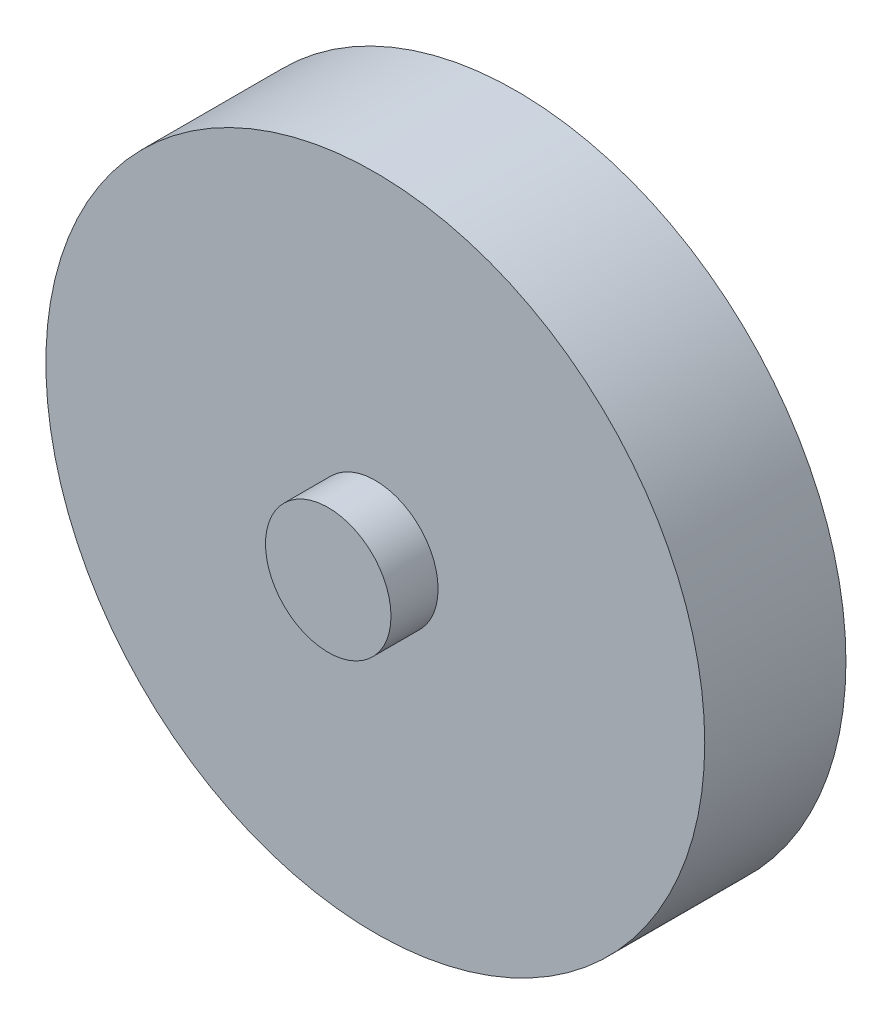
ISO-10303-21;
HEADER;
FILE_DESCRIPTION(('STEP AP214'),'2;1');
FILE_NAME('part.step','',(''),(''),'','','');
FILE_SCHEMA(('AUTOMOTIVE_DESIGN { 1 0 10303 214 1 1 1 1 }'));
ENDSEC;
DATA;
#1=APPLICATION_CONTEXT('core data for automotive mechanical design processes');
#2=APPLICATION_PROTOCOL_DEFINITION('international standard','automotive_design',2000,#1);
#3=PRODUCT_CONTEXT('',#1,'mechanical');
#4=PRODUCT('Part','Part','',(#3));
#5=PRODUCT_RELATED_PRODUCT_CATEGORY('part','',(#4));
#6=PRODUCT_DEFINITION_FORMATION('','',#4);
#7=PRODUCT_DEFINITION_CONTEXT('part definition',#1,'design');
#8=PRODUCT_DEFINITION('design','',#6,#7);
#9=PRODUCT_DEFINITION_SHAPE('','',#8);
#10=(LENGTH_UNIT() NAMED_UNIT(*) SI_UNIT(.MILLI.,.METRE.));
#11=(NAMED_UNIT(*) PLANE_ANGLE_UNIT() SI_UNIT($,.RADIAN.));
#12=(NAMED_UNIT(*) SI_UNIT($,.STERADIAN.) SOLID_ANGLE_UNIT());
#13=UNCERTAINTY_MEASURE_WITH_UNIT(LENGTH_MEASURE(1.E-05),#10,'distance_accuracy_value','');
#14=(GEOMETRIC_REPRESENTATION_CONTEXT(3) GLOBAL_UNCERTAINTY_ASSIGNED_CONTEXT((#13)) GLOBAL_UNIT_ASSIGNED_CONTEXT((#10,
#11,#12)) REPRESENTATION_CONTEXT('',''));
#15=CARTESIAN_POINT('',(0.,0.,0.));
#16=DIRECTION('',(0.,0.,1.));
#17=DIRECTION('',(1.,0.,0.));
#18=AXIS2_PLACEMENT_3D('',#15,#16,#17);
#19=CARTESIAN_POINT('',(0.,0.,24.));
#20=DIRECTION('',(0.,0.,-1.));
#21=DIRECTION('',(-1.,0.,0.));
#22=AXIS2_PLACEMENT_3D('',#19,#20,#21);
#23=CYLINDRICAL_SURFACE('',#22,8.);
#24=CARTESIAN_POINT('',(0.,0.,18.));
#25=DIRECTION('',(0.,0.,1.));
#26=DIRECTION('',(1.,0.,0.));
#27=AXIS2_PLACEMENT_3D('',#24,#25,#26);
#28=CIRCLE('',#27,8.);
#29=CARTESIAN_POINT('',(8.,0.,18.));
#30=VERTEX_POINT('',#29);
#31=EDGE_CURVE('E40',#30,#30,#28,.T.);
#32=ORIENTED_EDGE('',*,*,#31,.T.);
#33=EDGE_LOOP('',(#32));
#34=FACE_BOUND('',#33,.T.);
#35=CARTESIAN_POINT('',(0.,0.,24.));
#36=DIRECTION('',(0.,0.,1.));
#37=DIRECTION('',(1.,0.,0.));
#38=AXIS2_PLACEMENT_3D('',#35,#36,#37);
#39=CIRCLE('',#38,8.);
#40=CARTESIAN_POINT('',(8.,0.,24.));
#41=VERTEX_POINT('',#40);
#42=EDGE_CURVE('E10',#41,#41,#39,.T.);
#43=ORIENTED_EDGE('',*,*,#42,.F.);
#44=EDGE_LOOP('',(#43));
#45=FACE_BOUND('',#44,.T.);
#46=ADVANCED_FACE('F37',(#34,#45),#23,.T.);
#47=CARTESIAN_POINT('',(0.,0.,24.));
#48=DIRECTION('',(0.,0.,1.));
#49=DIRECTION('',(1.,0.,0.));
#50=AXIS2_PLACEMENT_3D('',#47,#48,#49);
#51=PLANE('',#50);
#52=ORIENTED_EDGE('',*,*,#42,.T.);
#53=EDGE_LOOP('',(#52));
#54=FACE_BOUND('',#53,.T.);
#55=ADVANCED_FACE('F60',(#54),#51,.T.);
#56=CARTESIAN_POINT('',(0.,0.,18.));
#57=DIRECTION('',(0.,0.,-1.));
#58=DIRECTION('',(-1.,0.,0.));
#59=AXIS2_PLACEMENT_3D('',#56,#57,#58);
#60=CYLINDRICAL_SURFACE('',#59,42.);
#61=CARTESIAN_POINT('',(0.,0.,18.));
#62=DIRECTION('',(0.,0.,1.));
#63=DIRECTION('',(1.,0.,0.));
#64=AXIS2_PLACEMENT_3D('',#61,#62,#63);
#65=CIRCLE('',#64,42.);
#66=CARTESIAN_POINT('',(42.,0.,18.));
#67=VERTEX_POINT('',#66);
#68=EDGE_CURVE('E47',#67,#67,#65,.T.);
#69=ORIENTED_EDGE('',*,*,#68,.F.);
#70=EDGE_LOOP('',(#69));
#71=FACE_BOUND('',#70,.T.);
#72=CARTESIAN_POINT('',(0.,0.,0.));
#73=DIRECTION('',(0.,0.,1.));
#74=DIRECTION('',(1.,0.,0.));
#75=AXIS2_PLACEMENT_3D('',#72,#73,#74);
#76=CIRCLE('',#75,42.);
#77=CARTESIAN_POINT('',(42.,0.,0.));
#78=VERTEX_POINT('',#77);
#79=EDGE_CURVE('E49',#78,#78,#76,.T.);
#80=ORIENTED_EDGE('',*,*,#79,.T.);
#81=EDGE_LOOP('',(#80));
#82=FACE_BOUND('',#81,.T.);
#83=ADVANCED_FACE('F57',(#71,#82),#60,.T.);
#84=CARTESIAN_POINT('',(0.,0.,18.));
#85=DIRECTION('',(0.,0.,1.));
#86=DIRECTION('',(1.,0.,0.));
#87=AXIS2_PLACEMENT_3D('',#84,#85,#86);
#88=PLANE('',#87);
#89=ORIENTED_EDGE('',*,*,#31,.F.);
#90=EDGE_LOOP('',(#89));
#91=FACE_BOUND('',#90,.T.);
#92=ORIENTED_EDGE('',*,*,#68,.T.);
#93=EDGE_LOOP('',(#92));
#94=FACE_BOUND('',#93,.T.);
#95=ADVANCED_FACE('F55',(#91,#94),#88,.T.);
#96=CARTESIAN_POINT('',(0.,0.,0.));
#97=DIRECTION('',(0.,0.,1.));
#98=DIRECTION('',(1.,0.,0.));
#99=AXIS2_PLACEMENT_3D('',#96,#97,#98);
#100=PLANE('',#99);
#101=ORIENTED_EDGE('',*,*,#79,.F.);
#102=EDGE_LOOP('',(#101));
#103=FACE_BOUND('',#102,.T.);
#104=ADVANCED_FACE('F64',(#103),#100,.F.);
#105=CLOSED_SHELL('',(#46,#55,#83,#95,#104));
#106=MANIFOLD_SOLID_BREP('B2',#105);
#107=ADVANCED_BREP_SHAPE_REPRESENTATION('',(#18,#106),#14);
#108=SHAPE_DEFINITION_REPRESENTATION(#9,#107);
ENDSEC;
END-ISO-10303-21;
